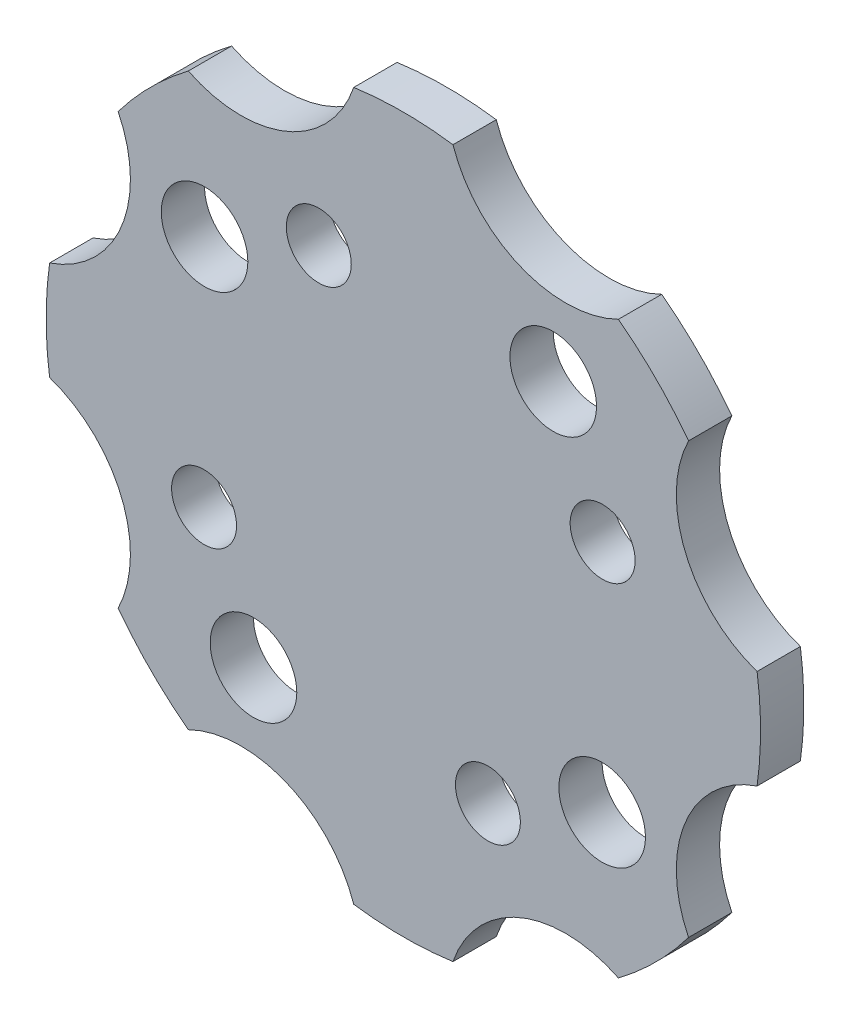
ISO-10303-21;
HEADER;
FILE_DESCRIPTION(('STEP AP214'),'2;1');
FILE_NAME('part.step','',(''),(''),'','','');
FILE_SCHEMA(('AUTOMOTIVE_DESIGN { 1 0 10303 214 1 1 1 1 }'));
ENDSEC;
DATA;
#1=APPLICATION_CONTEXT('core data for automotive mechanical design processes');
#2=APPLICATION_PROTOCOL_DEFINITION('international standard','automotive_design',2000,#1);
#3=PRODUCT_CONTEXT('',#1,'mechanical');
#4=PRODUCT('Part','Part','',(#3));
#5=PRODUCT_RELATED_PRODUCT_CATEGORY('part','',(#4));
#6=PRODUCT_DEFINITION_FORMATION('','',#4);
#7=PRODUCT_DEFINITION_CONTEXT('part definition',#1,'design');
#8=PRODUCT_DEFINITION('design','',#6,#7);
#9=PRODUCT_DEFINITION_SHAPE('','',#8);
#10=(LENGTH_UNIT() NAMED_UNIT(*) SI_UNIT(.MILLI.,.METRE.));
#11=(NAMED_UNIT(*) PLANE_ANGLE_UNIT() SI_UNIT($,.RADIAN.));
#12=(NAMED_UNIT(*) SI_UNIT($,.STERADIAN.) SOLID_ANGLE_UNIT());
#13=UNCERTAINTY_MEASURE_WITH_UNIT(LENGTH_MEASURE(1.E-05),#10,'distance_accuracy_value','');
#14=(GEOMETRIC_REPRESENTATION_CONTEXT(3) GLOBAL_UNCERTAINTY_ASSIGNED_CONTEXT((#13)) GLOBAL_UNIT_ASSIGNED_CONTEXT((#10,
#11,#12)) REPRESENTATION_CONTEXT('',''));
#15=CARTESIAN_POINT('',(0.,0.,0.));
#16=DIRECTION('',(0.,0.,1.));
#17=DIRECTION('',(1.,0.,0.));
#18=AXIS2_PLACEMENT_3D('',#15,#16,#17);
#19=CARTESIAN_POINT('',(-18.10803883722,7.50059527435515,2.));
#20=DIRECTION('',(0.,0.,-1.));
#21=DIRECTION('',(-1.,0.,0.));
#22=AXIS2_PLACEMENT_3D('',#19,#20,#21);
#23=CYLINDRICAL_SURFACE('',#22,5.50059527435572);
#24=CARTESIAN_POINT('',(-18.10803883722,7.50059527435515,0.));
#25=DIRECTION('',(0.,0.,1.));
#26=DIRECTION('',(1.,0.,0.));
#27=AXIS2_PLACEMENT_3D('',#24,#25,#26);
#28=CIRCLE('',#27,5.50059527435572);
#29=CARTESIAN_POINT('',(-16.3400523659574,2.29187448996894,0.));
#30=VERTEX_POINT('',#29);
#31=CARTESIAN_POINT('',(-13.1747618263974,9.93356183942612,0.));
#32=VERTEX_POINT('',#31);
#33=EDGE_CURVE('E183',#30,#32,#28,.T.);
#34=ORIENTED_EDGE('',*,*,#33,.F.);
#35=DIRECTION('',(0.,0.,-1.));
#36=VECTOR('',#35,1.);
#37=CARTESIAN_POINT('',(-16.3400523659574,2.29187448996894,2.));
#38=LINE('',#37,#36);
#39=CARTESIAN_POINT('',(-16.3400523659574,2.29187448996894,2.));
#40=VERTEX_POINT('',#39);
#41=EDGE_CURVE('E11',#40,#30,#38,.T.);
#42=ORIENTED_EDGE('',*,*,#41,.F.);
#43=CARTESIAN_POINT('',(-18.10803883722,7.50059527435515,2.));
#44=DIRECTION('',(0.,0.,1.));
#45=DIRECTION('',(1.,0.,0.));
#46=AXIS2_PLACEMENT_3D('',#43,#44,#45);
#47=CIRCLE('',#46,5.50059527435572);
#48=CARTESIAN_POINT('',(-13.1747618263974,9.93356183942612,2.));
#49=VERTEX_POINT('',#48);
#50=EDGE_CURVE('E271',#40,#49,#47,.T.);
#51=ORIENTED_EDGE('',*,*,#50,.T.);
#52=DIRECTION('',(0.,0.,-1.));
#53=VECTOR('',#52,1.);
#54=CARTESIAN_POINT('',(-13.1747618263974,9.93356183942612,2.));
#55=LINE('',#54,#53);
#56=EDGE_CURVE('E114',#49,#32,#55,.T.);
#57=ORIENTED_EDGE('',*,*,#56,.T.);
#58=EDGE_LOOP('',(#34,#42,#51,#57));
#59=FACE_BOUND('',#58,.T.);
#60=ADVANCED_FACE('F40',(#59),#23,.F.);
#61=CARTESIAN_POINT('',(0.,0.,2.));
#62=DIRECTION('',(0.,0.,-1.));
#63=DIRECTION('',(-1.,0.,0.));
#64=AXIS2_PLACEMENT_3D('',#61,#62,#63);
#65=CYLINDRICAL_SURFACE('',#64,16.5);
#66=CARTESIAN_POINT('',(0.,0.,0.));
#67=DIRECTION('',(0.,0.,1.));
#68=DIRECTION('',(1.,0.,0.));
#69=AXIS2_PLACEMENT_3D('',#66,#67,#68);
#70=CIRCLE('',#69,16.5);
#71=CARTESIAN_POINT('',(-16.3400523659573,-2.29187448996938,0.));
#72=VERTEX_POINT('',#71);
#73=EDGE_CURVE('E186',#30,#72,#70,.T.);
#74=ORIENTED_EDGE('',*,*,#73,.T.);
#75=DIRECTION('',(0.,0.,-1.));
#76=VECTOR('',#75,1.);
#77=CARTESIAN_POINT('',(-16.3400523659573,-2.29187448996938,2.));
#78=LINE('',#77,#76);
#79=CARTESIAN_POINT('',(-16.3400523659573,-2.29187448996938,2.));
#80=VERTEX_POINT('',#79);
#81=EDGE_CURVE('E48',#80,#72,#78,.T.);
#82=ORIENTED_EDGE('',*,*,#81,.F.);
#83=CARTESIAN_POINT('',(0.,0.,2.));
#84=DIRECTION('',(0.,0.,1.));
#85=DIRECTION('',(1.,0.,0.));
#86=AXIS2_PLACEMENT_3D('',#83,#84,#85);
#87=CIRCLE('',#86,16.5);
#88=EDGE_CURVE('E179',#40,#80,#87,.T.);
#89=ORIENTED_EDGE('',*,*,#88,.F.);
#90=ORIENTED_EDGE('',*,*,#41,.T.);
#91=EDGE_LOOP('',(#74,#82,#89,#90));
#92=FACE_BOUND('',#91,.T.);
#93=ADVANCED_FACE('F247',(#92),#65,.T.);
#94=CARTESIAN_POINT('',(-18.1080388372187,-7.50059527435599,2.));
#95=DIRECTION('',(0.,0.,-1.));
#96=DIRECTION('',(-1.,0.,0.));
#97=AXIS2_PLACEMENT_3D('',#94,#95,#96);
#98=CYLINDRICAL_SURFACE('',#97,5.50059527435572);
#99=CARTESIAN_POINT('',(-18.1080388372187,-7.50059527435599,0.));
#100=DIRECTION('',(0.,0.,1.));
#101=DIRECTION('',(1.,0.,0.));
#102=AXIS2_PLACEMENT_3D('',#99,#100,#101);
#103=CIRCLE('',#102,5.50059527435572);
#104=CARTESIAN_POINT('',(-13.1747618263963,-9.93356183942747,0.));
#105=VERTEX_POINT('',#104);
#106=EDGE_CURVE('E190',#105,#72,#103,.T.);
#107=ORIENTED_EDGE('',*,*,#106,.F.);
#108=DIRECTION('',(0.,0.,-1.));
#109=VECTOR('',#108,1.);
#110=CARTESIAN_POINT('',(-13.1747618263963,-9.93356183942747,2.));
#111=LINE('',#110,#109);
#112=CARTESIAN_POINT('',(-13.1747618263963,-9.93356183942747,2.));
#113=VERTEX_POINT('',#112);
#114=EDGE_CURVE('E237',#113,#105,#111,.T.);
#115=ORIENTED_EDGE('',*,*,#114,.F.);
#116=CARTESIAN_POINT('',(-18.1080388372187,-7.50059527435599,2.));
#117=DIRECTION('',(0.,0.,1.));
#118=DIRECTION('',(1.,0.,0.));
#119=AXIS2_PLACEMENT_3D('',#116,#117,#118);
#120=CIRCLE('',#119,5.50059527435572);
#121=EDGE_CURVE('E244',#113,#80,#120,.T.);
#122=ORIENTED_EDGE('',*,*,#121,.T.);
#123=ORIENTED_EDGE('',*,*,#81,.T.);
#124=EDGE_LOOP('',(#107,#115,#122,#123));
#125=FACE_BOUND('',#124,.T.);
#126=ADVANCED_FACE('F242',(#125),#98,.F.);
#127=CARTESIAN_POINT('',(-9.9335618394249,-13.1747618263983,0.));
#128=VERTEX_POINT('',#127);
#129=EDGE_CURVE('E192',#105,#128,#70,.T.);
#130=ORIENTED_EDGE('',*,*,#129,.T.);
#131=DIRECTION('',(0.,0.,-1.));
#132=VECTOR('',#131,1.);
#133=CARTESIAN_POINT('',(-9.9335618394249,-13.1747618263983,2.));
#134=LINE('',#133,#132);
#135=CARTESIAN_POINT('',(-9.9335618394249,-13.1747618263983,2.));
#136=VERTEX_POINT('',#135);
#137=EDGE_CURVE('E235',#136,#128,#134,.T.);
#138=ORIENTED_EDGE('',*,*,#137,.F.);
#139=EDGE_CURVE('E273',#113,#136,#87,.T.);
#140=ORIENTED_EDGE('',*,*,#139,.F.);
#141=ORIENTED_EDGE('',*,*,#114,.T.);
#142=EDGE_LOOP('',(#130,#138,#140,#141));
#143=FACE_BOUND('',#142,.T.);
#144=ADVANCED_FACE('F301',(#143),#65,.T.);
#145=CARTESIAN_POINT('',(-7.50059527435263,-18.1080388372203,2.));
#146=DIRECTION('',(0.,0.,-1.));
#147=DIRECTION('',(-1.,0.,0.));
#148=AXIS2_PLACEMENT_3D('',#145,#146,#147);
#149=CYLINDRICAL_SURFACE('',#148,5.50059527435572);
#150=CARTESIAN_POINT('',(-7.50059527435263,-18.1080388372203,0.));
#151=DIRECTION('',(0.,0.,1.));
#152=DIRECTION('',(1.,0.,0.));
#153=AXIS2_PLACEMENT_3D('',#150,#151,#152);
#154=CIRCLE('',#153,5.50059527435572);
#155=CARTESIAN_POINT('',(-2.29187448996641,-16.3400523659577,0.));
#156=VERTEX_POINT('',#155);
#157=EDGE_CURVE('E195',#156,#128,#154,.T.);
#158=ORIENTED_EDGE('',*,*,#157,.F.);
#159=DIRECTION('',(0.,0.,-1.));
#160=VECTOR('',#159,1.);
#161=CARTESIAN_POINT('',(-2.29187448996641,-16.3400523659577,2.));
#162=LINE('',#161,#160);
#163=CARTESIAN_POINT('',(-2.29187448996641,-16.3400523659577,2.));
#164=VERTEX_POINT('',#163);
#165=EDGE_CURVE('E233',#164,#156,#162,.T.);
#166=ORIENTED_EDGE('',*,*,#165,.F.);
#167=CARTESIAN_POINT('',(-7.50059527435263,-18.1080388372203,2.));
#168=DIRECTION('',(0.,0.,1.));
#169=DIRECTION('',(1.,0.,0.));
#170=AXIS2_PLACEMENT_3D('',#167,#168,#169);
#171=CIRCLE('',#170,5.50059527435572);
#172=EDGE_CURVE('E279',#164,#136,#171,.T.);
#173=ORIENTED_EDGE('',*,*,#172,.T.);
#174=ORIENTED_EDGE('',*,*,#137,.T.);
#175=EDGE_LOOP('',(#158,#166,#173,#174));
#176=FACE_BOUND('',#175,.T.);
#177=ADVANCED_FACE('F303',(#176),#149,.F.);
#178=CARTESIAN_POINT('',(2.29187448997211,-16.3400523659569,0.));
#179=VERTEX_POINT('',#178);
#180=EDGE_CURVE('E198',#156,#179,#70,.T.);
#181=ORIENTED_EDGE('',*,*,#180,.T.);
#182=DIRECTION('',(0.,0.,-1.));
#183=VECTOR('',#182,1.);
#184=CARTESIAN_POINT('',(2.29187448997211,-16.3400523659569,2.));
#185=LINE('',#184,#183);
#186=CARTESIAN_POINT('',(2.29187448997211,-16.3400523659569,2.));
#187=VERTEX_POINT('',#186);
#188=EDGE_CURVE('E231',#187,#179,#185,.T.);
#189=ORIENTED_EDGE('',*,*,#188,.F.);
#190=EDGE_CURVE('E282',#164,#187,#87,.T.);
#191=ORIENTED_EDGE('',*,*,#190,.F.);
#192=ORIENTED_EDGE('',*,*,#165,.T.);
#193=EDGE_LOOP('',(#181,#189,#191,#192));
#194=FACE_BOUND('',#193,.T.);
#195=ADVANCED_FACE('F304',(#194),#65,.T.);
#196=CARTESIAN_POINT('',(7.50059527435851,-18.108038837219,2.));
#197=DIRECTION('',(0.,0.,-1.));
#198=DIRECTION('',(-1.,0.,0.));
#199=AXIS2_PLACEMENT_3D('',#196,#197,#198);
#200=CYLINDRICAL_SURFACE('',#199,5.50059527435572);
#201=CARTESIAN_POINT('',(7.50059527435851,-18.108038837219,0.));
#202=DIRECTION('',(0.,0.,1.));
#203=DIRECTION('',(1.,0.,0.));
#204=AXIS2_PLACEMENT_3D('',#201,#202,#203);
#205=CIRCLE('',#204,5.50059527435572);
#206=CARTESIAN_POINT('',(9.93356183942826,-13.1747618263958,0.));
#207=VERTEX_POINT('',#206);
#208=EDGE_CURVE('E199',#207,#179,#205,.T.);
#209=ORIENTED_EDGE('',*,*,#208,.F.);
#210=DIRECTION('',(0.,0.,-1.));
#211=VECTOR('',#210,1.);
#212=CARTESIAN_POINT('',(9.93356183942826,-13.1747618263958,2.));
#213=LINE('',#212,#211);
#214=CARTESIAN_POINT('',(9.93356183942826,-13.1747618263958,2.));
#215=VERTEX_POINT('',#214);
#216=EDGE_CURVE('E229',#215,#207,#213,.T.);
#217=ORIENTED_EDGE('',*,*,#216,.F.);
#218=CARTESIAN_POINT('',(7.50059527435851,-18.108038837219,2.));
#219=DIRECTION('',(0.,0.,1.));
#220=DIRECTION('',(1.,0.,0.));
#221=AXIS2_PLACEMENT_3D('',#218,#219,#220);
#222=CIRCLE('',#221,5.50059527435572);
#223=EDGE_CURVE('E283',#215,#187,#222,.T.);
#224=ORIENTED_EDGE('',*,*,#223,.T.);
#225=ORIENTED_EDGE('',*,*,#188,.T.);
#226=EDGE_LOOP('',(#209,#217,#224,#225));
#227=FACE_BOUND('',#226,.T.);
#228=ADVANCED_FACE('F307',(#227),#200,.F.);
#229=CARTESIAN_POINT('',(13.1747618263997,-9.933561839423,0.));
#230=VERTEX_POINT('',#229);
#231=EDGE_CURVE('E202',#207,#230,#70,.T.);
#232=ORIENTED_EDGE('',*,*,#231,.T.);
#233=DIRECTION('',(0.,0.,-1.));
#234=VECTOR('',#233,1.);
#235=CARTESIAN_POINT('',(13.1747618263997,-9.933561839423,2.));
#236=LINE('',#235,#234);
#237=CARTESIAN_POINT('',(13.1747618263997,-9.933561839423,2.));
#238=VERTEX_POINT('',#237);
#239=EDGE_CURVE('E227',#238,#230,#236,.T.);
#240=ORIENTED_EDGE('',*,*,#239,.F.);
#241=EDGE_CURVE('E286',#215,#238,#87,.T.);
#242=ORIENTED_EDGE('',*,*,#241,.F.);
#243=ORIENTED_EDGE('',*,*,#216,.T.);
#244=EDGE_LOOP('',(#232,#240,#242,#243));
#245=FACE_BOUND('',#244,.T.);
#246=ADVANCED_FACE('F308',(#245),#65,.T.);
#247=CARTESIAN_POINT('',(18.1080388372228,-7.50059527435291,2.));
#248=DIRECTION('',(0.,0.,-1.));
#249=DIRECTION('',(-1.,0.,0.));
#250=AXIS2_PLACEMENT_3D('',#247,#248,#249);
#251=CYLINDRICAL_SURFACE('',#250,5.50059527435572);
#252=CARTESIAN_POINT('',(18.1080388372228,-7.50059527435291,0.));
#253=DIRECTION('',(0.,0.,1.));
#254=DIRECTION('',(1.,0.,0.));
#255=AXIS2_PLACEMENT_3D('',#252,#253,#254);
#256=CIRCLE('',#255,5.50059527435572);
#257=CARTESIAN_POINT('',(16.3400523659576,-2.29187448996759,0.));
#258=VERTEX_POINT('',#257);
#259=EDGE_CURVE('E203',#258,#230,#256,.T.);
#260=ORIENTED_EDGE('',*,*,#259,.F.);
#261=DIRECTION('',(0.,0.,-1.));
#262=VECTOR('',#261,1.);
#263=CARTESIAN_POINT('',(16.3400523659576,-2.29187448996759,2.));
#264=LINE('',#263,#262);
#265=CARTESIAN_POINT('',(16.3400523659576,-2.29187448996759,2.));
#266=VERTEX_POINT('',#265);
#267=EDGE_CURVE('E225',#266,#258,#264,.T.);
#268=ORIENTED_EDGE('',*,*,#267,.F.);
#269=CARTESIAN_POINT('',(18.1080388372228,-7.50059527435291,2.));
#270=DIRECTION('',(0.,0.,1.));
#271=DIRECTION('',(1.,0.,0.));
#272=AXIS2_PLACEMENT_3D('',#269,#270,#271);
#273=CIRCLE('',#272,5.50059527435572);
#274=EDGE_CURVE('E287',#266,#238,#273,.T.);
#275=ORIENTED_EDGE('',*,*,#274,.T.);
#276=ORIENTED_EDGE('',*,*,#239,.T.);
#277=EDGE_LOOP('',(#260,#268,#275,#276));
#278=FACE_BOUND('',#277,.T.);
#279=ADVANCED_FACE('F311',(#278),#251,.F.);
#280=CARTESIAN_POINT('',(16.3400523659569,2.29187448997273,0.));
#281=VERTEX_POINT('',#280);
#282=EDGE_CURVE('E206',#258,#281,#70,.T.);
#283=ORIENTED_EDGE('',*,*,#282,.T.);
#284=DIRECTION('',(0.,0.,-1.));
#285=VECTOR('',#284,1.);
#286=CARTESIAN_POINT('',(16.3400523659569,2.29187448997273,2.));
#287=LINE('',#286,#285);
#288=CARTESIAN_POINT('',(16.3400523659569,2.29187448997273,2.));
#289=VERTEX_POINT('',#288);
#290=EDGE_CURVE('E223',#289,#281,#287,.T.);
#291=ORIENTED_EDGE('',*,*,#290,.F.);
#292=EDGE_CURVE('E289',#266,#289,#87,.T.);
#293=ORIENTED_EDGE('',*,*,#292,.F.);
#294=ORIENTED_EDGE('',*,*,#267,.T.);
#295=EDGE_LOOP('',(#283,#291,#293,#294));
#296=FACE_BOUND('',#295,.T.);
#297=ADVANCED_FACE('F312',(#296),#65,.T.);
#298=CARTESIAN_POINT('',(18.1080388372215,7.50059527435823,2.));
#299=DIRECTION('',(0.,0.,-1.));
#300=DIRECTION('',(-1.,0.,0.));
#301=AXIS2_PLACEMENT_3D('',#298,#299,#300);
#302=CYLINDRICAL_SURFACE('',#301,5.50059527435571);
#303=CARTESIAN_POINT('',(18.1080388372215,7.50059527435823,0.));
#304=DIRECTION('',(0.,0.,1.));
#305=DIRECTION('',(1.,0.,0.));
#306=AXIS2_PLACEMENT_3D('',#303,#304,#305);
#307=CIRCLE('',#306,5.50059527435571);
#308=CARTESIAN_POINT('',(13.1747618263974,9.93356183942612,0.));
#309=VERTEX_POINT('',#308);
#310=EDGE_CURVE('E207',#309,#281,#307,.T.);
#311=ORIENTED_EDGE('',*,*,#310,.F.);
#312=DIRECTION('',(0.,0.,-1.));
#313=VECTOR('',#312,1.);
#314=CARTESIAN_POINT('',(13.1747618263974,9.93356183942612,2.));
#315=LINE('',#314,#313);
#316=CARTESIAN_POINT('',(13.1747618263974,9.93356183942612,2.));
#317=VERTEX_POINT('',#316);
#318=EDGE_CURVE('E221',#317,#309,#315,.T.);
#319=ORIENTED_EDGE('',*,*,#318,.F.);
#320=CARTESIAN_POINT('',(18.1080388372215,7.50059527435823,2.));
#321=DIRECTION('',(0.,0.,1.));
#322=DIRECTION('',(1.,0.,0.));
#323=AXIS2_PLACEMENT_3D('',#320,#321,#322);
#324=CIRCLE('',#323,5.50059527435571);
#325=EDGE_CURVE('E290',#317,#289,#324,.T.);
#326=ORIENTED_EDGE('',*,*,#325,.T.);
#327=ORIENTED_EDGE('',*,*,#290,.T.);
#328=EDGE_LOOP('',(#311,#319,#326,#327));
#329=FACE_BOUND('',#328,.T.);
#330=ADVANCED_FACE('F314',(#329),#302,.F.);
#331=CARTESIAN_POINT('',(9.93356183942421,13.1747618263988,0.));
#332=VERTEX_POINT('',#331);
#333=EDGE_CURVE('E210',#309,#332,#70,.T.);
#334=ORIENTED_EDGE('',*,*,#333,.T.);
#335=DIRECTION('',(0.,0.,-1.));
#336=VECTOR('',#335,1.);
#337=CARTESIAN_POINT('',(9.93356183942421,13.1747618263988,2.));
#338=LINE('',#337,#336);
#339=CARTESIAN_POINT('',(9.93356183942421,13.1747618263988,2.));
#340=VERTEX_POINT('',#339);
#341=EDGE_CURVE('E219',#340,#332,#338,.T.);
#342=ORIENTED_EDGE('',*,*,#341,.F.);
#343=EDGE_CURVE('E166',#317,#340,#87,.T.);
#344=ORIENTED_EDGE('',*,*,#343,.F.);
#345=ORIENTED_EDGE('',*,*,#318,.T.);
#346=EDGE_LOOP('',(#334,#342,#344,#345));
#347=FACE_BOUND('',#346,.T.);
#348=ADVANCED_FACE('F319',(#347),#65,.T.);
#349=CARTESIAN_POINT('',(7.50059527435543,18.1080388372225,2.));
#350=DIRECTION('',(0.,0.,-1.));
#351=DIRECTION('',(-1.,0.,0.));
#352=AXIS2_PLACEMENT_3D('',#349,#350,#351);
#353=CYLINDRICAL_SURFACE('',#352,5.50059527435572);
#354=CARTESIAN_POINT('',(7.50059527435543,18.1080388372225,0.));
#355=DIRECTION('',(0.,0.,1.));
#356=DIRECTION('',(1.,0.,0.));
#357=AXIS2_PLACEMENT_3D('',#354,#355,#356);
#358=CIRCLE('',#357,5.50059527435572);
#359=CARTESIAN_POINT('',(2.29187448997014,16.3400523659572,0.));
#360=VERTEX_POINT('',#359);
#361=EDGE_CURVE('E211',#360,#332,#358,.T.);
#362=ORIENTED_EDGE('',*,*,#361,.F.);
#363=DIRECTION('',(0.,0.,-1.));
#364=VECTOR('',#363,1.);
#365=CARTESIAN_POINT('',(2.29187448997014,16.3400523659572,2.));
#366=LINE('',#365,#364);
#367=CARTESIAN_POINT('',(2.29187448997014,16.3400523659572,2.));
#368=VERTEX_POINT('',#367);
#369=EDGE_CURVE('E175',#368,#360,#366,.T.);
#370=ORIENTED_EDGE('',*,*,#369,.F.);
#371=CARTESIAN_POINT('',(7.50059527435543,18.1080388372225,2.));
#372=DIRECTION('',(0.,0.,1.));
#373=DIRECTION('',(1.,0.,0.));
#374=AXIS2_PLACEMENT_3D('',#371,#372,#373);
#375=CIRCLE('',#374,5.50059527435572);
#376=EDGE_CURVE('E163',#368,#340,#375,.T.);
#377=ORIENTED_EDGE('',*,*,#376,.T.);
#378=ORIENTED_EDGE('',*,*,#341,.T.);
#379=EDGE_LOOP('',(#362,#370,#377,#378));
#380=FACE_BOUND('',#379,.T.);
#381=ADVANCED_FACE('F318',(#380),#353,.F.);
#382=CARTESIAN_POINT('',(-2.29187448996998,16.3400523659572,0.));
#383=VERTEX_POINT('',#382);
#384=EDGE_CURVE('E171',#360,#383,#70,.T.);
#385=ORIENTED_EDGE('',*,*,#384,.T.);
#386=DIRECTION('',(0.,0.,-1.));
#387=VECTOR('',#386,1.);
#388=CARTESIAN_POINT('',(-2.29187448996998,16.3400523659572,2.));
#389=LINE('',#388,#387);
#390=CARTESIAN_POINT('',(-2.29187448996998,16.3400523659572,2.));
#391=VERTEX_POINT('',#390);
#392=EDGE_CURVE('E168',#391,#383,#389,.T.);
#393=ORIENTED_EDGE('',*,*,#392,.F.);
#394=EDGE_CURVE('E157',#368,#391,#87,.T.);
#395=ORIENTED_EDGE('',*,*,#394,.F.);
#396=ORIENTED_EDGE('',*,*,#369,.T.);
#397=EDGE_LOOP('',(#385,#393,#395,#396));
#398=FACE_BOUND('',#397,.T.);
#399=ADVANCED_FACE('F169',(#398),#65,.T.);
#400=CARTESIAN_POINT('',(-7.50059527435571,18.1080388372212,2.));
#401=DIRECTION('',(0.,0.,-1.));
#402=DIRECTION('',(-1.,0.,0.));
#403=AXIS2_PLACEMENT_3D('',#400,#401,#402);
#404=CYLINDRICAL_SURFACE('',#403,5.50059527435571);
#405=CARTESIAN_POINT('',(-7.50059527435571,18.1080388372212,0.));
#406=DIRECTION('',(0.,0.,1.));
#407=DIRECTION('',(1.,0.,0.));
#408=AXIS2_PLACEMENT_3D('',#405,#406,#407);
#409=CIRCLE('',#408,5.50059527435571);
#410=CARTESIAN_POINT('',(-9.93356183942535,13.1747618263979,0.));
#411=VERTEX_POINT('',#410);
#412=EDGE_CURVE('E214',#411,#383,#409,.T.);
#413=ORIENTED_EDGE('',*,*,#412,.F.);
#414=DIRECTION('',(0.,0.,-1.));
#415=VECTOR('',#414,1.);
#416=CARTESIAN_POINT('',(-9.93356183942535,13.1747618263979,2.));
#417=LINE('',#416,#415);
#418=CARTESIAN_POINT('',(-9.93356183942535,13.1747618263979,2.));
#419=VERTEX_POINT('',#418);
#420=EDGE_CURVE('E107',#419,#411,#417,.T.);
#421=ORIENTED_EDGE('',*,*,#420,.F.);
#422=CARTESIAN_POINT('',(-7.50059527435571,18.1080388372212,2.));
#423=DIRECTION('',(0.,0.,1.));
#424=DIRECTION('',(1.,0.,0.));
#425=AXIS2_PLACEMENT_3D('',#422,#423,#424);
#426=CIRCLE('',#425,5.50059527435571);
#427=EDGE_CURVE('E161',#419,#391,#426,.T.);
#428=ORIENTED_EDGE('',*,*,#427,.T.);
#429=ORIENTED_EDGE('',*,*,#392,.T.);
#430=EDGE_LOOP('',(#413,#421,#428,#429));
#431=FACE_BOUND('',#430,.T.);
#432=ADVANCED_FACE('F177',(#431),#404,.F.);
#433=EDGE_CURVE('E191',#411,#32,#70,.T.);
#434=ORIENTED_EDGE('',*,*,#433,.T.);
#435=ORIENTED_EDGE('',*,*,#56,.F.);
#436=EDGE_CURVE('E56',#419,#49,#87,.T.);
#437=ORIENTED_EDGE('',*,*,#436,.F.);
#438=ORIENTED_EDGE('',*,*,#420,.T.);
#439=EDGE_LOOP('',(#434,#435,#437,#438));
#440=FACE_BOUND('',#439,.T.);
#441=ADVANCED_FACE('F328',(#440),#65,.T.);
#442=CARTESIAN_POINT('',(0.,0.,2.));
#443=DIRECTION('',(0.,0.,1.));
#444=DIRECTION('',(1.,0.,0.));
#445=AXIS2_PLACEMENT_3D('',#442,#443,#444);
#446=PLANE('',#445);
#447=CARTESIAN_POINT('',(-9.20563110427134,-3.90593855200841,2.));
#448=DIRECTION('',(0.,0.,1.));
#449=DIRECTION('',(1.,0.,0.));
#450=AXIS2_PLACEMENT_3D('',#447,#448,#449);
#451=CIRCLE('',#450,1.50000000000044);
#452=CARTESIAN_POINT('',(-7.7056311042709,-3.90593855200841,2.));
#453=VERTEX_POINT('',#452);
#454=EDGE_CURVE('E503',#453,#453,#451,.T.);
#455=ORIENTED_EDGE('',*,*,#454,.F.);
#456=EDGE_LOOP('',(#455));
#457=FACE_BOUND('',#456,.T.);
#458=CARTESIAN_POINT('',(9.1832761983657,-6.92224228588876,2.));
#459=DIRECTION('',(0.,0.,1.));
#460=DIRECTION('',(1.,0.,0.));
#461=AXIS2_PLACEMENT_3D('',#458,#459,#460);
#462=CIRCLE('',#461,1.9999999999997);
#463=CARTESIAN_POINT('',(11.1832761983654,-6.92224228588876,2.));
#464=VERTEX_POINT('',#463);
#465=EDGE_CURVE('E506',#464,#464,#462,.T.);
#466=ORIENTED_EDGE('',*,*,#465,.F.);
#467=EDGE_LOOP('',(#466));
#468=FACE_BOUND('',#467,.T.);
#469=CARTESIAN_POINT('',(3.90593855200832,-9.20563110427217,2.));
#470=DIRECTION('',(0.,0.,1.));
#471=DIRECTION('',(1.,0.,0.));
#472=AXIS2_PLACEMENT_3D('',#469,#470,#471);
#473=CIRCLE('',#472,1.49999999999968);
#474=CARTESIAN_POINT('',(5.405938552008,-9.20563110427217,2.));
#475=VERTEX_POINT('',#474);
#476=EDGE_CURVE('E522',#475,#475,#473,.T.);
#477=ORIENTED_EDGE('',*,*,#476,.F.);
#478=EDGE_LOOP('',(#477));
#479=FACE_BOUND('',#478,.T.);
#480=CARTESIAN_POINT('',(6.92224228588867,9.18327619836488,2.));
#481=DIRECTION('',(0.,0.,1.));
#482=DIRECTION('',(1.,0.,0.));
#483=AXIS2_PLACEMENT_3D('',#480,#481,#482);
#484=CIRCLE('',#483,2.);
#485=CARTESIAN_POINT('',(8.92224228588867,9.18327619836488,2.));
#486=VERTEX_POINT('',#485);
#487=EDGE_CURVE('E516',#486,#486,#484,.T.);
#488=ORIENTED_EDGE('',*,*,#487,.F.);
#489=EDGE_LOOP('',(#488));
#490=FACE_BOUND('',#489,.T.);
#491=CARTESIAN_POINT('',(-9.18327619836497,6.92224228588784,2.));
#492=DIRECTION('',(0.,0.,1.));
#493=DIRECTION('',(1.,0.,0.));
#494=AXIS2_PLACEMENT_3D('',#491,#492,#493);
#495=CIRCLE('',#494,2.00000000000083);
#496=CARTESIAN_POINT('',(-7.18327619836414,6.92224228588784,2.));
#497=VERTEX_POINT('',#496);
#498=EDGE_CURVE('E549',#497,#497,#495,.T.);
#499=ORIENTED_EDGE('',*,*,#498,.F.);
#500=EDGE_LOOP('',(#499));
#501=FACE_BOUND('',#500,.T.);
#502=CARTESIAN_POINT('',(-3.90593855200758,9.20563110427126,2.));
#503=DIRECTION('',(0.,0.,1.));
#504=DIRECTION('',(1.,0.,0.));
#505=AXIS2_PLACEMENT_3D('',#502,#503,#504);
#506=CIRCLE('',#505,1.50000000000077);
#507=CARTESIAN_POINT('',(-2.40593855200681,9.20563110427126,2.));
#508=VERTEX_POINT('',#507);
#509=EDGE_CURVE('E540',#508,#508,#506,.T.);
#510=ORIENTED_EDGE('',*,*,#509,.F.);
#511=EDGE_LOOP('',(#510));
#512=FACE_BOUND('',#511,.T.);
#513=CARTESIAN_POINT('',(-6.92224228588793,-9.18327619836579,2.));
#514=DIRECTION('',(0.,0.,1.));
#515=DIRECTION('',(1.,0.,0.));
#516=AXIS2_PLACEMENT_3D('',#513,#514,#515);
#517=CIRCLE('',#516,2.00000000000048);
#518=CARTESIAN_POINT('',(-4.92224228588745,-9.18327619836579,2.));
#519=VERTEX_POINT('',#518);
#520=EDGE_CURVE('E509',#519,#519,#517,.T.);
#521=ORIENTED_EDGE('',*,*,#520,.F.);
#522=EDGE_LOOP('',(#521));
#523=FACE_BOUND('',#522,.T.);
#524=CARTESIAN_POINT('',(9.20563110427208,3.9059385520075,2.));
#525=DIRECTION('',(0.,0.,1.));
#526=DIRECTION('',(1.,0.,0.));
#527=AXIS2_PLACEMENT_3D('',#524,#525,#526);
#528=CIRCLE('',#527,1.5);
#529=CARTESIAN_POINT('',(10.7056311042721,3.9059385520075,2.));
#530=VERTEX_POINT('',#529);
#531=EDGE_CURVE('E275',#530,#530,#528,.T.);
#532=ORIENTED_EDGE('',*,*,#531,.F.);
#533=EDGE_LOOP('',(#532));
#534=FACE_BOUND('',#533,.T.);
#535=ORIENTED_EDGE('',*,*,#50,.F.);
#536=ORIENTED_EDGE('',*,*,#88,.T.);
#537=ORIENTED_EDGE('',*,*,#121,.F.);
#538=ORIENTED_EDGE('',*,*,#139,.T.);
#539=ORIENTED_EDGE('',*,*,#172,.F.);
#540=ORIENTED_EDGE('',*,*,#190,.T.);
#541=ORIENTED_EDGE('',*,*,#223,.F.);
#542=ORIENTED_EDGE('',*,*,#241,.T.);
#543=ORIENTED_EDGE('',*,*,#274,.F.);
#544=ORIENTED_EDGE('',*,*,#292,.T.);
#545=ORIENTED_EDGE('',*,*,#325,.F.);
#546=ORIENTED_EDGE('',*,*,#343,.T.);
#547=ORIENTED_EDGE('',*,*,#376,.F.);
#548=ORIENTED_EDGE('',*,*,#394,.T.);
#549=ORIENTED_EDGE('',*,*,#427,.F.);
#550=ORIENTED_EDGE('',*,*,#436,.T.);
#551=EDGE_LOOP('',(#535,#536,#537,#538,#539,#540,#541,#542,#543,#544,#545,#546,#547,#548,#549,#550));
#552=FACE_BOUND('',#551,.T.);
#553=ADVANCED_FACE('F159',(#457,#468,#479,#490,#501,#512,#523,#534,#552),#446,.T.);
#554=CARTESIAN_POINT('',(0.,0.,0.));
#555=DIRECTION('',(0.,0.,1.));
#556=DIRECTION('',(1.,0.,0.));
#557=AXIS2_PLACEMENT_3D('',#554,#555,#556);
#558=PLANE('',#557);
#559=CARTESIAN_POINT('',(-9.20563110427134,-3.90593855200841,0.));
#560=DIRECTION('',(0.,0.,1.));
#561=DIRECTION('',(1.,0.,0.));
#562=AXIS2_PLACEMENT_3D('',#559,#560,#561);
#563=CIRCLE('',#562,1.50000000000044);
#564=CARTESIAN_POINT('',(-7.7056311042709,-3.90593855200841,0.));
#565=VERTEX_POINT('',#564);
#566=EDGE_CURVE('E500',#565,#565,#563,.T.);
#567=ORIENTED_EDGE('',*,*,#566,.T.);
#568=EDGE_LOOP('',(#567));
#569=FACE_BOUND('',#568,.T.);
#570=CARTESIAN_POINT('',(9.1832761983657,-6.92224228588876,0.));
#571=DIRECTION('',(0.,0.,1.));
#572=DIRECTION('',(1.,0.,0.));
#573=AXIS2_PLACEMENT_3D('',#570,#571,#572);
#574=CIRCLE('',#573,1.9999999999997);
#575=CARTESIAN_POINT('',(11.1832761983654,-6.92224228588876,0.));
#576=VERTEX_POINT('',#575);
#577=EDGE_CURVE('E524',#576,#576,#574,.T.);
#578=ORIENTED_EDGE('',*,*,#577,.T.);
#579=EDGE_LOOP('',(#578));
#580=FACE_BOUND('',#579,.T.);
#581=CARTESIAN_POINT('',(3.90593855200832,-9.20563110427217,0.));
#582=DIRECTION('',(0.,0.,1.));
#583=DIRECTION('',(1.,0.,0.));
#584=AXIS2_PLACEMENT_3D('',#581,#582,#583);
#585=CIRCLE('',#584,1.49999999999968);
#586=CARTESIAN_POINT('',(5.405938552008,-9.20563110427217,0.));
#587=VERTEX_POINT('',#586);
#588=EDGE_CURVE('E519',#587,#587,#585,.T.);
#589=ORIENTED_EDGE('',*,*,#588,.T.);
#590=EDGE_LOOP('',(#589));
#591=FACE_BOUND('',#590,.T.);
#592=CARTESIAN_POINT('',(6.92224228588867,9.18327619836488,0.));
#593=DIRECTION('',(0.,0.,1.));
#594=DIRECTION('',(1.,0.,0.));
#595=AXIS2_PLACEMENT_3D('',#592,#593,#594);
#596=CIRCLE('',#595,2.);
#597=CARTESIAN_POINT('',(8.92224228588867,9.18327619836488,0.));
#598=VERTEX_POINT('',#597);
#599=EDGE_CURVE('E513',#598,#598,#596,.T.);
#600=ORIENTED_EDGE('',*,*,#599,.T.);
#601=EDGE_LOOP('',(#600));
#602=FACE_BOUND('',#601,.T.);
#603=CARTESIAN_POINT('',(-9.18327619836497,6.92224228588784,0.));
#604=DIRECTION('',(0.,0.,1.));
#605=DIRECTION('',(1.,0.,0.));
#606=AXIS2_PLACEMENT_3D('',#603,#604,#605);
#607=CIRCLE('',#606,2.00000000000083);
#608=CARTESIAN_POINT('',(-7.18327619836414,6.92224228588784,0.));
#609=VERTEX_POINT('',#608);
#610=EDGE_CURVE('E544',#609,#609,#607,.T.);
#611=ORIENTED_EDGE('',*,*,#610,.T.);
#612=EDGE_LOOP('',(#611));
#613=FACE_BOUND('',#612,.T.);
#614=CARTESIAN_POINT('',(-3.90593855200758,9.20563110427126,0.));
#615=DIRECTION('',(0.,0.,1.));
#616=DIRECTION('',(1.,0.,0.));
#617=AXIS2_PLACEMENT_3D('',#614,#615,#616);
#618=CIRCLE('',#617,1.50000000000077);
#619=CARTESIAN_POINT('',(-2.40593855200681,9.20563110427126,0.));
#620=VERTEX_POINT('',#619);
#621=EDGE_CURVE('E543',#620,#620,#618,.T.);
#622=ORIENTED_EDGE('',*,*,#621,.T.);
#623=EDGE_LOOP('',(#622));
#624=FACE_BOUND('',#623,.T.);
#625=CARTESIAN_POINT('',(-6.92224228588793,-9.18327619836579,0.));
#626=DIRECTION('',(0.,0.,1.));
#627=DIRECTION('',(1.,0.,0.));
#628=AXIS2_PLACEMENT_3D('',#625,#626,#627);
#629=CIRCLE('',#628,2.00000000000048);
#630=CARTESIAN_POINT('',(-4.92224228588745,-9.18327619836579,0.));
#631=VERTEX_POINT('',#630);
#632=EDGE_CURVE('E504',#631,#631,#629,.T.);
#633=ORIENTED_EDGE('',*,*,#632,.T.);
#634=EDGE_LOOP('',(#633));
#635=FACE_BOUND('',#634,.T.);
#636=CARTESIAN_POINT('',(9.20563110427208,3.9059385520075,0.));
#637=DIRECTION('',(0.,0.,1.));
#638=DIRECTION('',(1.,0.,0.));
#639=AXIS2_PLACEMENT_3D('',#636,#637,#638);
#640=CIRCLE('',#639,1.5);
#641=CARTESIAN_POINT('',(10.7056311042721,3.9059385520075,0.));
#642=VERTEX_POINT('',#641);
#643=EDGE_CURVE('E187',#642,#642,#640,.T.);
#644=ORIENTED_EDGE('',*,*,#643,.T.);
#645=EDGE_LOOP('',(#644));
#646=FACE_BOUND('',#645,.T.);
#647=ORIENTED_EDGE('',*,*,#33,.T.);
#648=ORIENTED_EDGE('',*,*,#433,.F.);
#649=ORIENTED_EDGE('',*,*,#412,.T.);
#650=ORIENTED_EDGE('',*,*,#384,.F.);
#651=ORIENTED_EDGE('',*,*,#361,.T.);
#652=ORIENTED_EDGE('',*,*,#333,.F.);
#653=ORIENTED_EDGE('',*,*,#310,.T.);
#654=ORIENTED_EDGE('',*,*,#282,.F.);
#655=ORIENTED_EDGE('',*,*,#259,.T.);
#656=ORIENTED_EDGE('',*,*,#231,.F.);
#657=ORIENTED_EDGE('',*,*,#208,.T.);
#658=ORIENTED_EDGE('',*,*,#180,.F.);
#659=ORIENTED_EDGE('',*,*,#157,.T.);
#660=ORIENTED_EDGE('',*,*,#129,.F.);
#661=ORIENTED_EDGE('',*,*,#106,.T.);
#662=ORIENTED_EDGE('',*,*,#73,.F.);
#663=EDGE_LOOP('',(#647,#648,#649,#650,#651,#652,#653,#654,#655,#656,#657,#658,#659,#660,#661,#662));
#664=FACE_BOUND('',#663,.T.);
#665=ADVANCED_FACE('F250',(#569,#580,#591,#602,#613,#624,#635,#646,#664),#558,.F.);
#666=CARTESIAN_POINT('',(9.20563110427208,3.9059385520075,0.));
#667=DIRECTION('',(0.,0.,1.));
#668=DIRECTION('',(1.,0.,0.));
#669=AXIS2_PLACEMENT_3D('',#666,#667,#668);
#670=CYLINDRICAL_SURFACE('',#669,1.5);
#671=ORIENTED_EDGE('',*,*,#643,.F.);
#672=EDGE_LOOP('',(#671));
#673=FACE_BOUND('',#672,.T.);
#674=ORIENTED_EDGE('',*,*,#531,.T.);
#675=EDGE_LOOP('',(#674));
#676=FACE_BOUND('',#675,.T.);
#677=ADVANCED_FACE('F415',(#673,#676),#670,.F.);
#678=CARTESIAN_POINT('',(-6.92224228588793,-9.18327619836579,0.));
#679=DIRECTION('',(0.,0.,1.));
#680=DIRECTION('',(1.,0.,0.));
#681=AXIS2_PLACEMENT_3D('',#678,#679,#680);
#682=CYLINDRICAL_SURFACE('',#681,2.00000000000048);
#683=ORIENTED_EDGE('',*,*,#632,.F.);
#684=EDGE_LOOP('',(#683));
#685=FACE_BOUND('',#684,.T.);
#686=ORIENTED_EDGE('',*,*,#520,.T.);
#687=EDGE_LOOP('',(#686));
#688=FACE_BOUND('',#687,.T.);
#689=ADVANCED_FACE('F423',(#685,#688),#682,.F.);
#690=CARTESIAN_POINT('',(-3.90593855200758,9.20563110427126,0.));
#691=DIRECTION('',(0.,0.,1.));
#692=DIRECTION('',(1.,0.,0.));
#693=AXIS2_PLACEMENT_3D('',#690,#691,#692);
#694=CYLINDRICAL_SURFACE('',#693,1.50000000000077);
#695=ORIENTED_EDGE('',*,*,#621,.F.);
#696=EDGE_LOOP('',(#695));
#697=FACE_BOUND('',#696,.T.);
#698=ORIENTED_EDGE('',*,*,#509,.T.);
#699=EDGE_LOOP('',(#698));
#700=FACE_BOUND('',#699,.T.);
#701=ADVANCED_FACE('F433',(#697,#700),#694,.F.);
#702=CARTESIAN_POINT('',(-9.18327619836497,6.92224228588784,0.));
#703=DIRECTION('',(0.,0.,1.));
#704=DIRECTION('',(1.,0.,0.));
#705=AXIS2_PLACEMENT_3D('',#702,#703,#704);
#706=CYLINDRICAL_SURFACE('',#705,2.00000000000083);
#707=ORIENTED_EDGE('',*,*,#610,.F.);
#708=EDGE_LOOP('',(#707));
#709=FACE_BOUND('',#708,.T.);
#710=ORIENTED_EDGE('',*,*,#498,.T.);
#711=EDGE_LOOP('',(#710));
#712=FACE_BOUND('',#711,.T.);
#713=ADVANCED_FACE('F443',(#709,#712),#706,.F.);
#714=CARTESIAN_POINT('',(6.92224228588867,9.18327619836488,0.));
#715=DIRECTION('',(0.,0.,1.));
#716=DIRECTION('',(1.,0.,0.));
#717=AXIS2_PLACEMENT_3D('',#714,#715,#716);
#718=CYLINDRICAL_SURFACE('',#717,2.);
#719=ORIENTED_EDGE('',*,*,#599,.F.);
#720=EDGE_LOOP('',(#719));
#721=FACE_BOUND('',#720,.T.);
#722=ORIENTED_EDGE('',*,*,#487,.T.);
#723=EDGE_LOOP('',(#722));
#724=FACE_BOUND('',#723,.T.);
#725=ADVANCED_FACE('F453',(#721,#724),#718,.F.);
#726=CARTESIAN_POINT('',(3.90593855200832,-9.20563110427217,0.));
#727=DIRECTION('',(0.,0.,1.));
#728=DIRECTION('',(1.,0.,0.));
#729=AXIS2_PLACEMENT_3D('',#726,#727,#728);
#730=CYLINDRICAL_SURFACE('',#729,1.49999999999968);
#731=ORIENTED_EDGE('',*,*,#588,.F.);
#732=EDGE_LOOP('',(#731));
#733=FACE_BOUND('',#732,.T.);
#734=ORIENTED_EDGE('',*,*,#476,.T.);
#735=EDGE_LOOP('',(#734));
#736=FACE_BOUND('',#735,.T.);
#737=ADVANCED_FACE('F463',(#733,#736),#730,.F.);
#738=CARTESIAN_POINT('',(9.1832761983657,-6.92224228588876,0.));
#739=DIRECTION('',(0.,0.,1.));
#740=DIRECTION('',(1.,0.,0.));
#741=AXIS2_PLACEMENT_3D('',#738,#739,#740);
#742=CYLINDRICAL_SURFACE('',#741,1.9999999999997);
#743=ORIENTED_EDGE('',*,*,#577,.F.);
#744=EDGE_LOOP('',(#743));
#745=FACE_BOUND('',#744,.T.);
#746=ORIENTED_EDGE('',*,*,#465,.T.);
#747=EDGE_LOOP('',(#746));
#748=FACE_BOUND('',#747,.T.);
#749=ADVANCED_FACE('F473',(#745,#748),#742,.F.);
#750=CARTESIAN_POINT('',(-9.20563110427134,-3.90593855200841,0.));
#751=DIRECTION('',(0.,0.,1.));
#752=DIRECTION('',(1.,0.,0.));
#753=AXIS2_PLACEMENT_3D('',#750,#751,#752);
#754=CYLINDRICAL_SURFACE('',#753,1.50000000000044);
#755=ORIENTED_EDGE('',*,*,#566,.F.);
#756=EDGE_LOOP('',(#755));
#757=FACE_BOUND('',#756,.T.);
#758=ORIENTED_EDGE('',*,*,#454,.T.);
#759=EDGE_LOOP('',(#758));
#760=FACE_BOUND('',#759,.T.);
#761=ADVANCED_FACE('F483',(#757,#760),#754,.F.);
#762=CLOSED_SHELL('',(#60,#93,#126,#144,#177,#195,#228,#246,#279,#297,#330,#348,#381,#399,#432,
#441,#553,#665,#677,#689,#701,#713,#725,#737,#749,#761));
#763=MANIFOLD_SOLID_BREP('B2',#762);
#764=ADVANCED_BREP_SHAPE_REPRESENTATION('',(#18,#763),#14);
#765=SHAPE_DEFINITION_REPRESENTATION(#9,#764);
ENDSEC;
END-ISO-10303-21;
